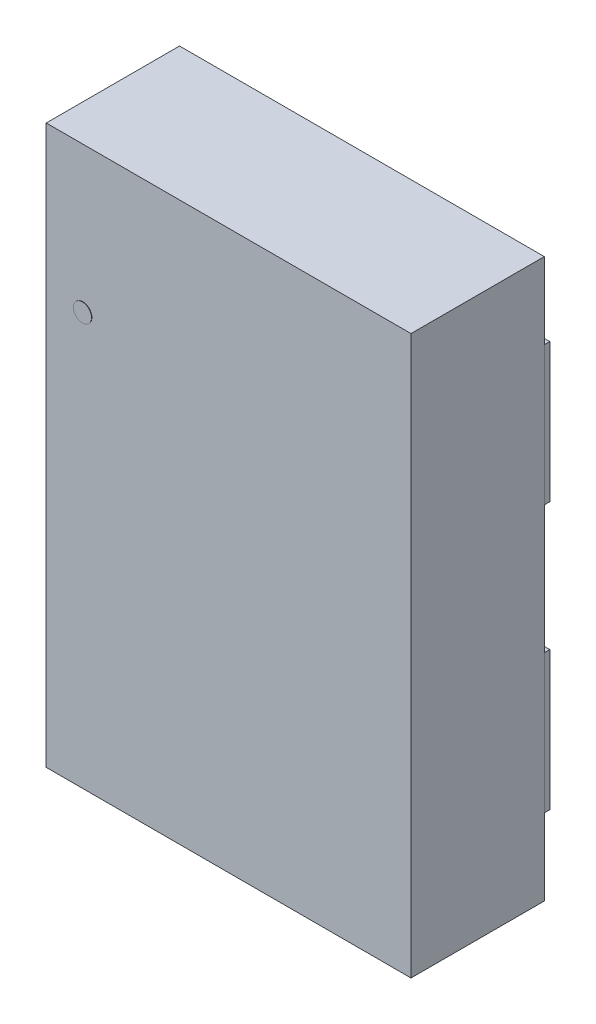
ISO-10303-21;
HEADER;
FILE_DESCRIPTION(('STEP AP214'),'2;1');
FILE_NAME('part.step','',(''),(''),'','','');
FILE_SCHEMA(('AUTOMOTIVE_DESIGN { 1 0 10303 214 1 1 1 1 }'));
ENDSEC;
DATA;
#1=APPLICATION_CONTEXT('core data for automotive mechanical design processes');
#2=APPLICATION_PROTOCOL_DEFINITION('international standard','automotive_design',2000,#1);
#3=PRODUCT_CONTEXT('',#1,'mechanical');
#4=PRODUCT('Part','Part','',(#3));
#5=PRODUCT_RELATED_PRODUCT_CATEGORY('part','',(#4));
#6=PRODUCT_DEFINITION_FORMATION('','',#4);
#7=PRODUCT_DEFINITION_CONTEXT('part definition',#1,'design');
#8=PRODUCT_DEFINITION('design','',#6,#7);
#9=PRODUCT_DEFINITION_SHAPE('','',#8);
#10=(LENGTH_UNIT() NAMED_UNIT(*) SI_UNIT(.MILLI.,.METRE.));
#11=(NAMED_UNIT(*) PLANE_ANGLE_UNIT() SI_UNIT($,.RADIAN.));
#12=(NAMED_UNIT(*) SI_UNIT($,.STERADIAN.) SOLID_ANGLE_UNIT());
#13=UNCERTAINTY_MEASURE_WITH_UNIT(LENGTH_MEASURE(1.E-05),#10,'distance_accuracy_value','');
#14=(GEOMETRIC_REPRESENTATION_CONTEXT(3) GLOBAL_UNCERTAINTY_ASSIGNED_CONTEXT((#13)) GLOBAL_UNIT_ASSIGNED_CONTEXT((#10,
#11,#12)) REPRESENTATION_CONTEXT('',''));
#15=CARTESIAN_POINT('',(0.,0.,0.));
#16=DIRECTION('',(0.,0.,1.));
#17=DIRECTION('',(1.,0.,0.));
#18=AXIS2_PLACEMENT_3D('',#15,#16,#17);
#19=CARTESIAN_POINT('',(1.702,-1.892,0.));
#20=DIRECTION('',(0.,0.,-1.));
#21=DIRECTION('',(-1.,0.,0.));
#22=AXIS2_PLACEMENT_3D('',#19,#20,#21);
#23=PLANE('',#22);
#24=DIRECTION('',(1.,0.,0.));
#25=VECTOR('',#24,1.);
#26=CARTESIAN_POINT('',(1.702,-0.597,0.));
#27=LINE('',#26,#25);
#28=CARTESIAN_POINT('',(1.702,-0.597,0.));
#29=VERTEX_POINT('',#28);
#30=CARTESIAN_POINT('',(0.559,-0.597,0.));
#31=VERTEX_POINT('',#30);
#32=EDGE_CURVE('P0_E62',#29,#31,#27,.F.);
#33=ORIENTED_EDGE('',*,*,#32,.F.);
#34=DIRECTION('',(0.,1.,0.));
#35=VECTOR('',#34,1.);
#36=CARTESIAN_POINT('',(1.702,-1.892,0.));
#37=LINE('',#36,#35);
#38=CARTESIAN_POINT('',(1.702,-1.892,0.));
#39=VERTEX_POINT('',#38);
#40=EDGE_CURVE('P0_E19',#39,#29,#37,.T.);
#41=ORIENTED_EDGE('',*,*,#40,.F.);
#42=DIRECTION('',(1.,0.,0.));
#43=VECTOR('',#42,1.);
#44=CARTESIAN_POINT('',(0.559,-1.892,0.));
#45=LINE('',#44,#43);
#46=CARTESIAN_POINT('',(0.559,-1.892,0.));
#47=VERTEX_POINT('',#46);
#48=EDGE_CURVE('P0_E81',#47,#39,#45,.T.);
#49=ORIENTED_EDGE('',*,*,#48,.F.);
#50=DIRECTION('',(0.,1.,0.));
#51=VECTOR('',#50,1.);
#52=CARTESIAN_POINT('',(0.559,-0.597,0.));
#53=LINE('',#52,#51);
#54=EDGE_CURVE('P0_E60',#31,#47,#53,.F.);
#55=ORIENTED_EDGE('',*,*,#54,.F.);
#56=EDGE_LOOP('',(#33,#41,#49,#55));
#57=FACE_BOUND('',#56,.T.);
#58=ADVANCED_FACE('P0_F16',(#57),#23,.T.);
#59=CARTESIAN_POINT('',(1.702,-1.892,0.));
#60=DIRECTION('',(1.,0.,0.));
#61=DIRECTION('',(0.,0.,-1.));
#62=AXIS2_PLACEMENT_3D('',#59,#60,#61);
#63=PLANE('',#62);
#64=DIRECTION('',(0.,0.,1.));
#65=VECTOR('',#64,1.);
#66=CARTESIAN_POINT('',(1.702,-1.892,0.051));
#67=LINE('',#66,#65);
#68=CARTESIAN_POINT('',(1.702,-1.892,0.051));
#69=VERTEX_POINT('',#68);
#70=CARTESIAN_POINT('',(1.702,-1.892,0.648));
#71=VERTEX_POINT('',#70);
#72=EDGE_CURVE('P0_E34',#69,#71,#67,.T.);
#73=ORIENTED_EDGE('',*,*,#72,.F.);
#74=DIRECTION('',(0.,0.,-1.));
#75=VECTOR('',#74,1.);
#76=CARTESIAN_POINT('',(1.702,-1.892,0.));
#77=LINE('',#76,#75);
#78=EDGE_CURVE('P0_E70',#39,#69,#77,.F.);
#79=ORIENTED_EDGE('',*,*,#78,.F.);
#80=ORIENTED_EDGE('',*,*,#40,.T.);
#81=DIRECTION('',(0.,0.,1.));
#82=VECTOR('',#81,1.);
#83=CARTESIAN_POINT('',(1.702,-0.597,0.));
#84=LINE('',#83,#82);
#85=CARTESIAN_POINT('',(1.702,-0.597,0.051));
#86=VERTEX_POINT('',#85);
#87=EDGE_CURVE('P0_E67',#86,#29,#84,.F.);
#88=ORIENTED_EDGE('',*,*,#87,.F.);
#89=DIRECTION('',(0.,0.,1.));
#90=VECTOR('',#89,1.);
#91=CARTESIAN_POINT('',(1.702,-0.597,0.051));
#92=LINE('',#91,#90);
#93=CARTESIAN_POINT('',(1.702,-0.597,0.648));
#94=VERTEX_POINT('',#93);
#95=EDGE_CURVE('P0_E91',#94,#86,#92,.F.);
#96=ORIENTED_EDGE('',*,*,#95,.F.);
#97=DIRECTION('',(0.,1.,0.));
#98=VECTOR('',#97,1.);
#99=CARTESIAN_POINT('',(1.702,-0.597,0.648));
#100=LINE('',#99,#98);
#101=EDGE_CURVE('P0_E88',#71,#94,#100,.T.);
#102=ORIENTED_EDGE('',*,*,#101,.F.);
#103=EDGE_LOOP('',(#73,#79,#80,#88,#96,#102));
#104=FACE_BOUND('',#103,.T.);
#105=ADVANCED_FACE('P0_F68',(#104),#63,.T.);
#106=CARTESIAN_POINT('',(1.702,-0.597,0.));
#107=DIRECTION('',(0.,1.,0.));
#108=DIRECTION('',(0.,0.,1.));
#109=AXIS2_PLACEMENT_3D('',#106,#107,#108);
#110=PLANE('',#109);
#111=DIRECTION('',(1.,0.,0.));
#112=VECTOR('',#111,1.);
#113=CARTESIAN_POINT('',(1.702,-0.597,0.051));
#114=LINE('',#113,#112);
#115=CARTESIAN_POINT('',(0.559,-0.597,0.051));
#116=VERTEX_POINT('',#115);
#117=EDGE_CURVE('P0_E74',#86,#116,#114,.F.);
#118=ORIENTED_EDGE('',*,*,#117,.F.);
#119=ORIENTED_EDGE('',*,*,#87,.T.);
#120=ORIENTED_EDGE('',*,*,#32,.T.);
#121=DIRECTION('',(0.,0.,1.));
#122=VECTOR('',#121,1.);
#123=CARTESIAN_POINT('',(0.559,-0.597,0.));
#124=LINE('',#123,#122);
#125=EDGE_CURVE('P0_E77',#116,#31,#124,.F.);
#126=ORIENTED_EDGE('',*,*,#125,.F.);
#127=EDGE_LOOP('',(#118,#119,#120,#126));
#128=FACE_BOUND('',#127,.T.);
#129=ADVANCED_FACE('P0_F72',(#128),#110,.T.);
#130=CARTESIAN_POINT('',(0.559,-0.597,0.));
#131=DIRECTION('',(-1.,0.,0.));
#132=DIRECTION('',(0.,0.,1.));
#133=AXIS2_PLACEMENT_3D('',#130,#131,#132);
#134=PLANE('',#133);
#135=DIRECTION('',(0.,1.,0.));
#136=VECTOR('',#135,1.);
#137=CARTESIAN_POINT('',(0.559,-0.597,0.051));
#138=LINE('',#137,#136);
#139=CARTESIAN_POINT('',(0.559,-1.892,0.051));
#140=VERTEX_POINT('',#139);
#141=EDGE_CURVE('P0_E94',#116,#140,#138,.F.);
#142=ORIENTED_EDGE('',*,*,#141,.F.);
#143=ORIENTED_EDGE('',*,*,#125,.T.);
#144=ORIENTED_EDGE('',*,*,#54,.T.);
#145=DIRECTION('',(0.,0.,-1.));
#146=VECTOR('',#145,1.);
#147=CARTESIAN_POINT('',(0.559,-1.892,0.));
#148=LINE('',#147,#146);
#149=EDGE_CURVE('P0_E84',#140,#47,#148,.T.);
#150=ORIENTED_EDGE('',*,*,#149,.F.);
#151=EDGE_LOOP('',(#142,#143,#144,#150));
#152=FACE_BOUND('',#151,.T.);
#153=ADVANCED_FACE('P0_F115',(#152),#134,.T.);
#154=CARTESIAN_POINT('',(0.559,-1.892,0.));
#155=DIRECTION('',(0.,-1.,0.));
#156=DIRECTION('',(0.,0.,-1.));
#157=AXIS2_PLACEMENT_3D('',#154,#155,#156);
#158=PLANE('',#157);
#159=DIRECTION('',(1.,0.,0.));
#160=VECTOR('',#159,1.);
#161=CARTESIAN_POINT('',(1.702,-1.892,0.051));
#162=LINE('',#161,#160);
#163=EDGE_CURVE('P0_E25',#140,#69,#162,.T.);
#164=ORIENTED_EDGE('',*,*,#163,.F.);
#165=ORIENTED_EDGE('',*,*,#149,.T.);
#166=ORIENTED_EDGE('',*,*,#48,.T.);
#167=ORIENTED_EDGE('',*,*,#78,.T.);
#168=EDGE_LOOP('',(#164,#165,#166,#167));
#169=FACE_BOUND('',#168,.T.);
#170=ADVANCED_FACE('P0_F104',(#169),#158,.T.);
#171=CARTESIAN_POINT('',(1.702,-0.597,0.051));
#172=DIRECTION('',(-1.,0.,0.));
#173=DIRECTION('',(0.,0.,1.));
#174=AXIS2_PLACEMENT_3D('',#171,#172,#173);
#175=PLANE('',#174);
#176=ORIENTED_EDGE('',*,*,#101,.T.);
#177=ORIENTED_EDGE('',*,*,#95,.T.);
#178=DIRECTION('',(0.,1.,0.));
#179=VECTOR('',#178,1.);
#180=CARTESIAN_POINT('',(1.702,-0.597,0.051));
#181=LINE('',#180,#179);
#182=EDGE_CURVE('P0_E11',#69,#86,#181,.T.);
#183=ORIENTED_EDGE('',*,*,#182,.F.);
#184=ORIENTED_EDGE('',*,*,#72,.T.);
#185=EDGE_LOOP('',(#176,#177,#183,#184));
#186=FACE_BOUND('',#185,.T.);
#187=ADVANCED_FACE('P0_F106',(#186),#175,.T.);
#188=CARTESIAN_POINT('',(1.702,-0.597,0.051));
#189=DIRECTION('',(0.,0.,1.));
#190=DIRECTION('',(1.,0.,0.));
#191=AXIS2_PLACEMENT_3D('',#188,#189,#190);
#192=PLANE('',#191);
#193=ORIENTED_EDGE('',*,*,#163,.T.);
#194=ORIENTED_EDGE('',*,*,#182,.T.);
#195=ORIENTED_EDGE('',*,*,#117,.T.);
#196=ORIENTED_EDGE('',*,*,#141,.T.);
#197=EDGE_LOOP('',(#193,#194,#195,#196));
#198=FACE_BOUND('',#197,.T.);
#199=ADVANCED_FACE('P0_F100',(#198),#192,.T.);
#200=CLOSED_SHELL('',(#58,#105,#129,#153,#170,#187,#199));
#201=MANIFOLD_SOLID_BREP('P0_B1',#200);
#202=CARTESIAN_POINT('',(1.702,0.597,0.));
#203=DIRECTION('',(0.,0.,-1.));
#204=DIRECTION('',(-1.,0.,0.));
#205=AXIS2_PLACEMENT_3D('',#202,#203,#204);
#206=PLANE('',#205);
#207=DIRECTION('',(1.,0.,0.));
#208=VECTOR('',#207,1.);
#209=CARTESIAN_POINT('',(1.702,1.892,0.));
#210=LINE('',#209,#208);
#211=CARTESIAN_POINT('',(1.702,1.892,0.));
#212=VERTEX_POINT('',#211);
#213=CARTESIAN_POINT('',(0.559,1.892,0.));
#214=VERTEX_POINT('',#213);
#215=EDGE_CURVE('P1_E62',#212,#214,#210,.F.);
#216=ORIENTED_EDGE('',*,*,#215,.F.);
#217=DIRECTION('',(0.,1.,0.));
#218=VECTOR('',#217,1.);
#219=CARTESIAN_POINT('',(1.702,0.597,0.));
#220=LINE('',#219,#218);
#221=CARTESIAN_POINT('',(1.702,0.597,0.));
#222=VERTEX_POINT('',#221);
#223=EDGE_CURVE('P1_E19',#222,#212,#220,.T.);
#224=ORIENTED_EDGE('',*,*,#223,.F.);
#225=DIRECTION('',(1.,0.,0.));
#226=VECTOR('',#225,1.);
#227=CARTESIAN_POINT('',(0.559,0.597,0.));
#228=LINE('',#227,#226);
#229=CARTESIAN_POINT('',(0.559,0.597,0.));
#230=VERTEX_POINT('',#229);
#231=EDGE_CURVE('P1_E81',#230,#222,#228,.T.);
#232=ORIENTED_EDGE('',*,*,#231,.F.);
#233=DIRECTION('',(0.,1.,0.));
#234=VECTOR('',#233,1.);
#235=CARTESIAN_POINT('',(0.559,1.892,0.));
#236=LINE('',#235,#234);
#237=EDGE_CURVE('P1_E60',#214,#230,#236,.F.);
#238=ORIENTED_EDGE('',*,*,#237,.F.);
#239=EDGE_LOOP('',(#216,#224,#232,#238));
#240=FACE_BOUND('',#239,.T.);
#241=ADVANCED_FACE('P1_F16',(#240),#206,.T.);
#242=CARTESIAN_POINT('',(1.702,0.597,0.));
#243=DIRECTION('',(1.,0.,0.));
#244=DIRECTION('',(0.,0.,-1.));
#245=AXIS2_PLACEMENT_3D('',#242,#243,#244);
#246=PLANE('',#245);
#247=DIRECTION('',(0.,0.,1.));
#248=VECTOR('',#247,1.);
#249=CARTESIAN_POINT('',(1.702,0.597,0.051));
#250=LINE('',#249,#248);
#251=CARTESIAN_POINT('',(1.702,0.597,0.051));
#252=VERTEX_POINT('',#251);
#253=CARTESIAN_POINT('',(1.702,0.597,0.648));
#254=VERTEX_POINT('',#253);
#255=EDGE_CURVE('P1_E34',#252,#254,#250,.T.);
#256=ORIENTED_EDGE('',*,*,#255,.F.);
#257=DIRECTION('',(0.,0.,-1.));
#258=VECTOR('',#257,1.);
#259=CARTESIAN_POINT('',(1.702,0.597,0.));
#260=LINE('',#259,#258);
#261=EDGE_CURVE('P1_E70',#222,#252,#260,.F.);
#262=ORIENTED_EDGE('',*,*,#261,.F.);
#263=ORIENTED_EDGE('',*,*,#223,.T.);
#264=DIRECTION('',(0.,0.,1.));
#265=VECTOR('',#264,1.);
#266=CARTESIAN_POINT('',(1.702,1.892,0.));
#267=LINE('',#266,#265);
#268=CARTESIAN_POINT('',(1.702,1.892,0.051));
#269=VERTEX_POINT('',#268);
#270=EDGE_CURVE('P1_E67',#269,#212,#267,.F.);
#271=ORIENTED_EDGE('',*,*,#270,.F.);
#272=DIRECTION('',(0.,0.,1.));
#273=VECTOR('',#272,1.);
#274=CARTESIAN_POINT('',(1.702,1.892,0.051));
#275=LINE('',#274,#273);
#276=CARTESIAN_POINT('',(1.702,1.892,0.648));
#277=VERTEX_POINT('',#276);
#278=EDGE_CURVE('P1_E91',#277,#269,#275,.F.);
#279=ORIENTED_EDGE('',*,*,#278,.F.);
#280=DIRECTION('',(0.,1.,0.));
#281=VECTOR('',#280,1.);
#282=CARTESIAN_POINT('',(1.702,1.892,0.648));
#283=LINE('',#282,#281);
#284=EDGE_CURVE('P1_E88',#254,#277,#283,.T.);
#285=ORIENTED_EDGE('',*,*,#284,.F.);
#286=EDGE_LOOP('',(#256,#262,#263,#271,#279,#285));
#287=FACE_BOUND('',#286,.T.);
#288=ADVANCED_FACE('P1_F68',(#287),#246,.T.);
#289=CARTESIAN_POINT('',(1.702,1.892,0.));
#290=DIRECTION('',(0.,1.,0.));
#291=DIRECTION('',(0.,0.,1.));
#292=AXIS2_PLACEMENT_3D('',#289,#290,#291);
#293=PLANE('',#292);
#294=DIRECTION('',(1.,0.,0.));
#295=VECTOR('',#294,1.);
#296=CARTESIAN_POINT('',(1.702,1.892,0.051));
#297=LINE('',#296,#295);
#298=CARTESIAN_POINT('',(0.559,1.892,0.051));
#299=VERTEX_POINT('',#298);
#300=EDGE_CURVE('P1_E74',#269,#299,#297,.F.);
#301=ORIENTED_EDGE('',*,*,#300,.F.);
#302=ORIENTED_EDGE('',*,*,#270,.T.);
#303=ORIENTED_EDGE('',*,*,#215,.T.);
#304=DIRECTION('',(0.,0.,1.));
#305=VECTOR('',#304,1.);
#306=CARTESIAN_POINT('',(0.559,1.892,0.));
#307=LINE('',#306,#305);
#308=EDGE_CURVE('P1_E77',#299,#214,#307,.F.);
#309=ORIENTED_EDGE('',*,*,#308,.F.);
#310=EDGE_LOOP('',(#301,#302,#303,#309));
#311=FACE_BOUND('',#310,.T.);
#312=ADVANCED_FACE('P1_F72',(#311),#293,.T.);
#313=CARTESIAN_POINT('',(0.559,1.892,0.));
#314=DIRECTION('',(-1.,0.,0.));
#315=DIRECTION('',(0.,0.,1.));
#316=AXIS2_PLACEMENT_3D('',#313,#314,#315);
#317=PLANE('',#316);
#318=DIRECTION('',(0.,1.,0.));
#319=VECTOR('',#318,1.);
#320=CARTESIAN_POINT('',(0.559,1.892,0.051));
#321=LINE('',#320,#319);
#322=CARTESIAN_POINT('',(0.559,0.597,0.051));
#323=VERTEX_POINT('',#322);
#324=EDGE_CURVE('P1_E94',#299,#323,#321,.F.);
#325=ORIENTED_EDGE('',*,*,#324,.F.);
#326=ORIENTED_EDGE('',*,*,#308,.T.);
#327=ORIENTED_EDGE('',*,*,#237,.T.);
#328=DIRECTION('',(0.,0.,-1.));
#329=VECTOR('',#328,1.);
#330=CARTESIAN_POINT('',(0.559,0.597,0.));
#331=LINE('',#330,#329);
#332=EDGE_CURVE('P1_E84',#323,#230,#331,.T.);
#333=ORIENTED_EDGE('',*,*,#332,.F.);
#334=EDGE_LOOP('',(#325,#326,#327,#333));
#335=FACE_BOUND('',#334,.T.);
#336=ADVANCED_FACE('P1_F115',(#335),#317,.T.);
#337=CARTESIAN_POINT('',(0.559,0.597,0.));
#338=DIRECTION('',(0.,-1.,0.));
#339=DIRECTION('',(0.,0.,-1.));
#340=AXIS2_PLACEMENT_3D('',#337,#338,#339);
#341=PLANE('',#340);
#342=DIRECTION('',(1.,0.,0.));
#343=VECTOR('',#342,1.);
#344=CARTESIAN_POINT('',(1.702,0.597,0.051));
#345=LINE('',#344,#343);
#346=EDGE_CURVE('P1_E25',#323,#252,#345,.T.);
#347=ORIENTED_EDGE('',*,*,#346,.F.);
#348=ORIENTED_EDGE('',*,*,#332,.T.);
#349=ORIENTED_EDGE('',*,*,#231,.T.);
#350=ORIENTED_EDGE('',*,*,#261,.T.);
#351=EDGE_LOOP('',(#347,#348,#349,#350));
#352=FACE_BOUND('',#351,.T.);
#353=ADVANCED_FACE('P1_F104',(#352),#341,.T.);
#354=CARTESIAN_POINT('',(1.702,1.892,0.051));
#355=DIRECTION('',(-1.,0.,0.));
#356=DIRECTION('',(0.,0.,1.));
#357=AXIS2_PLACEMENT_3D('',#354,#355,#356);
#358=PLANE('',#357);
#359=ORIENTED_EDGE('',*,*,#284,.T.);
#360=ORIENTED_EDGE('',*,*,#278,.T.);
#361=DIRECTION('',(0.,1.,0.));
#362=VECTOR('',#361,1.);
#363=CARTESIAN_POINT('',(1.702,1.892,0.051));
#364=LINE('',#363,#362);
#365=EDGE_CURVE('P1_E11',#252,#269,#364,.T.);
#366=ORIENTED_EDGE('',*,*,#365,.F.);
#367=ORIENTED_EDGE('',*,*,#255,.T.);
#368=EDGE_LOOP('',(#359,#360,#366,#367));
#369=FACE_BOUND('',#368,.T.);
#370=ADVANCED_FACE('P1_F106',(#369),#358,.T.);
#371=CARTESIAN_POINT('',(1.702,1.892,0.051));
#372=DIRECTION('',(0.,0.,1.));
#373=DIRECTION('',(1.,0.,0.));
#374=AXIS2_PLACEMENT_3D('',#371,#372,#373);
#375=PLANE('',#374);
#376=ORIENTED_EDGE('',*,*,#346,.T.);
#377=ORIENTED_EDGE('',*,*,#365,.T.);
#378=ORIENTED_EDGE('',*,*,#300,.T.);
#379=ORIENTED_EDGE('',*,*,#324,.T.);
#380=EDGE_LOOP('',(#376,#377,#378,#379));
#381=FACE_BOUND('',#380,.T.);
#382=ADVANCED_FACE('P1_F100',(#381),#375,.T.);
#383=CLOSED_SHELL('',(#241,#288,#312,#336,#353,#370,#382));
#384=MANIFOLD_SOLID_BREP('P1_B1',#383);
#385=CARTESIAN_POINT('',(-1.702,-0.597,0.));
#386=DIRECTION('',(0.,0.,-1.));
#387=DIRECTION('',(-1.,0.,0.));
#388=AXIS2_PLACEMENT_3D('',#385,#386,#387);
#389=PLANE('',#388);
#390=DIRECTION('',(1.,0.,0.));
#391=VECTOR('',#390,1.);
#392=CARTESIAN_POINT('',(-1.702,-1.892,0.));
#393=LINE('',#392,#391);
#394=CARTESIAN_POINT('',(-1.702,-1.892,0.));
#395=VERTEX_POINT('',#394);
#396=CARTESIAN_POINT('',(-0.559,-1.892,0.));
#397=VERTEX_POINT('',#396);
#398=EDGE_CURVE('P2_E62',#395,#397,#393,.T.);
#399=ORIENTED_EDGE('',*,*,#398,.F.);
#400=DIRECTION('',(0.,1.,0.));
#401=VECTOR('',#400,1.);
#402=CARTESIAN_POINT('',(-1.702,-0.597,0.));
#403=LINE('',#402,#401);
#404=CARTESIAN_POINT('',(-1.702,-0.597,0.));
#405=VERTEX_POINT('',#404);
#406=EDGE_CURVE('P2_E19',#405,#395,#403,.F.);
#407=ORIENTED_EDGE('',*,*,#406,.F.);
#408=DIRECTION('',(1.,0.,0.));
#409=VECTOR('',#408,1.);
#410=CARTESIAN_POINT('',(-0.559,-0.597,0.));
#411=LINE('',#410,#409);
#412=CARTESIAN_POINT('',(-0.559,-0.597,0.));
#413=VERTEX_POINT('',#412);
#414=EDGE_CURVE('P2_E81',#413,#405,#411,.F.);
#415=ORIENTED_EDGE('',*,*,#414,.F.);
#416=DIRECTION('',(0.,1.,0.));
#417=VECTOR('',#416,1.);
#418=CARTESIAN_POINT('',(-0.559,-1.892,0.));
#419=LINE('',#418,#417);
#420=EDGE_CURVE('P2_E60',#397,#413,#419,.T.);
#421=ORIENTED_EDGE('',*,*,#420,.F.);
#422=EDGE_LOOP('',(#399,#407,#415,#421));
#423=FACE_BOUND('',#422,.T.);
#424=ADVANCED_FACE('P2_F16',(#423),#389,.T.);
#425=CARTESIAN_POINT('',(-1.702,-0.597,0.));
#426=DIRECTION('',(-1.,0.,0.));
#427=DIRECTION('',(0.,0.,1.));
#428=AXIS2_PLACEMENT_3D('',#425,#426,#427);
#429=PLANE('',#428);
#430=DIRECTION('',(0.,0.,-1.));
#431=VECTOR('',#430,1.);
#432=CARTESIAN_POINT('',(-1.702,-0.597,0.051));
#433=LINE('',#432,#431);
#434=CARTESIAN_POINT('',(-1.702,-0.597,0.051));
#435=VERTEX_POINT('',#434);
#436=CARTESIAN_POINT('',(-1.702,-0.597,0.648));
#437=VERTEX_POINT('',#436);
#438=EDGE_CURVE('P2_E34',#435,#437,#433,.F.);
#439=ORIENTED_EDGE('',*,*,#438,.F.);
#440=DIRECTION('',(0.,0.,1.));
#441=VECTOR('',#440,1.);
#442=CARTESIAN_POINT('',(-1.702,-0.597,0.));
#443=LINE('',#442,#441);
#444=EDGE_CURVE('P2_E70',#405,#435,#443,.T.);
#445=ORIENTED_EDGE('',*,*,#444,.F.);
#446=ORIENTED_EDGE('',*,*,#406,.T.);
#447=DIRECTION('',(0.,0.,-1.));
#448=VECTOR('',#447,1.);
#449=CARTESIAN_POINT('',(-1.702,-1.892,0.));
#450=LINE('',#449,#448);
#451=CARTESIAN_POINT('',(-1.702,-1.892,0.051));
#452=VERTEX_POINT('',#451);
#453=EDGE_CURVE('P2_E67',#452,#395,#450,.T.);
#454=ORIENTED_EDGE('',*,*,#453,.F.);
#455=DIRECTION('',(0.,0.,-1.));
#456=VECTOR('',#455,1.);
#457=CARTESIAN_POINT('',(-1.702,-1.892,0.051));
#458=LINE('',#457,#456);
#459=CARTESIAN_POINT('',(-1.702,-1.892,0.648));
#460=VERTEX_POINT('',#459);
#461=EDGE_CURVE('P2_E91',#460,#452,#458,.T.);
#462=ORIENTED_EDGE('',*,*,#461,.F.);
#463=DIRECTION('',(0.,1.,0.));
#464=VECTOR('',#463,1.);
#465=CARTESIAN_POINT('',(-1.702,-1.892,0.648));
#466=LINE('',#465,#464);
#467=EDGE_CURVE('P2_E88',#437,#460,#466,.F.);
#468=ORIENTED_EDGE('',*,*,#467,.F.);
#469=EDGE_LOOP('',(#439,#445,#446,#454,#462,#468));
#470=FACE_BOUND('',#469,.T.);
#471=ADVANCED_FACE('P2_F68',(#470),#429,.T.);
#472=CARTESIAN_POINT('',(-1.702,-1.892,0.));
#473=DIRECTION('',(0.,-1.,0.));
#474=DIRECTION('',(0.,0.,-1.));
#475=AXIS2_PLACEMENT_3D('',#472,#473,#474);
#476=PLANE('',#475);
#477=DIRECTION('',(1.,0.,0.));
#478=VECTOR('',#477,1.);
#479=CARTESIAN_POINT('',(-1.702,-1.892,0.051));
#480=LINE('',#479,#478);
#481=CARTESIAN_POINT('',(-0.559,-1.892,0.051));
#482=VERTEX_POINT('',#481);
#483=EDGE_CURVE('P2_E74',#452,#482,#480,.T.);
#484=ORIENTED_EDGE('',*,*,#483,.F.);
#485=ORIENTED_EDGE('',*,*,#453,.T.);
#486=ORIENTED_EDGE('',*,*,#398,.T.);
#487=DIRECTION('',(0.,0.,-1.));
#488=VECTOR('',#487,1.);
#489=CARTESIAN_POINT('',(-0.559,-1.892,0.));
#490=LINE('',#489,#488);
#491=EDGE_CURVE('P2_E77',#482,#397,#490,.T.);
#492=ORIENTED_EDGE('',*,*,#491,.F.);
#493=EDGE_LOOP('',(#484,#485,#486,#492));
#494=FACE_BOUND('',#493,.T.);
#495=ADVANCED_FACE('P2_F72',(#494),#476,.T.);
#496=CARTESIAN_POINT('',(-0.559,-1.892,0.));
#497=DIRECTION('',(1.,0.,0.));
#498=DIRECTION('',(0.,0.,-1.));
#499=AXIS2_PLACEMENT_3D('',#496,#497,#498);
#500=PLANE('',#499);
#501=DIRECTION('',(0.,1.,0.));
#502=VECTOR('',#501,1.);
#503=CARTESIAN_POINT('',(-0.559,-1.892,0.051));
#504=LINE('',#503,#502);
#505=CARTESIAN_POINT('',(-0.559,-0.597,0.051));
#506=VERTEX_POINT('',#505);
#507=EDGE_CURVE('P2_E94',#482,#506,#504,.T.);
#508=ORIENTED_EDGE('',*,*,#507,.F.);
#509=ORIENTED_EDGE('',*,*,#491,.T.);
#510=ORIENTED_EDGE('',*,*,#420,.T.);
#511=DIRECTION('',(0.,0.,1.));
#512=VECTOR('',#511,1.);
#513=CARTESIAN_POINT('',(-0.559,-0.597,0.));
#514=LINE('',#513,#512);
#515=EDGE_CURVE('P2_E84',#506,#413,#514,.F.);
#516=ORIENTED_EDGE('',*,*,#515,.F.);
#517=EDGE_LOOP('',(#508,#509,#510,#516));
#518=FACE_BOUND('',#517,.T.);
#519=ADVANCED_FACE('P2_F115',(#518),#500,.T.);
#520=CARTESIAN_POINT('',(-0.559,-0.597,0.));
#521=DIRECTION('',(0.,1.,0.));
#522=DIRECTION('',(0.,0.,1.));
#523=AXIS2_PLACEMENT_3D('',#520,#521,#522);
#524=PLANE('',#523);
#525=DIRECTION('',(1.,0.,0.));
#526=VECTOR('',#525,1.);
#527=CARTESIAN_POINT('',(-1.702,-0.597,0.051));
#528=LINE('',#527,#526);
#529=EDGE_CURVE('P2_E25',#506,#435,#528,.F.);
#530=ORIENTED_EDGE('',*,*,#529,.F.);
#531=ORIENTED_EDGE('',*,*,#515,.T.);
#532=ORIENTED_EDGE('',*,*,#414,.T.);
#533=ORIENTED_EDGE('',*,*,#444,.T.);
#534=EDGE_LOOP('',(#530,#531,#532,#533));
#535=FACE_BOUND('',#534,.T.);
#536=ADVANCED_FACE('P2_F104',(#535),#524,.T.);
#537=CARTESIAN_POINT('',(-1.702,-1.892,0.051));
#538=DIRECTION('',(1.,0.,0.));
#539=DIRECTION('',(0.,0.,-1.));
#540=AXIS2_PLACEMENT_3D('',#537,#538,#539);
#541=PLANE('',#540);
#542=ORIENTED_EDGE('',*,*,#467,.T.);
#543=ORIENTED_EDGE('',*,*,#461,.T.);
#544=DIRECTION('',(0.,1.,0.));
#545=VECTOR('',#544,1.);
#546=CARTESIAN_POINT('',(-1.702,-1.892,0.051));
#547=LINE('',#546,#545);
#548=EDGE_CURVE('P2_E11',#435,#452,#547,.F.);
#549=ORIENTED_EDGE('',*,*,#548,.F.);
#550=ORIENTED_EDGE('',*,*,#438,.T.);
#551=EDGE_LOOP('',(#542,#543,#549,#550));
#552=FACE_BOUND('',#551,.T.);
#553=ADVANCED_FACE('P2_F106',(#552),#541,.T.);
#554=CARTESIAN_POINT('',(-1.702,-1.892,0.051));
#555=DIRECTION('',(0.,0.,1.));
#556=DIRECTION('',(1.,0.,0.));
#557=AXIS2_PLACEMENT_3D('',#554,#555,#556);
#558=PLANE('',#557);
#559=ORIENTED_EDGE('',*,*,#529,.T.);
#560=ORIENTED_EDGE('',*,*,#548,.T.);
#561=ORIENTED_EDGE('',*,*,#483,.T.);
#562=ORIENTED_EDGE('',*,*,#507,.T.);
#563=EDGE_LOOP('',(#559,#560,#561,#562));
#564=FACE_BOUND('',#563,.T.);
#565=ADVANCED_FACE('P2_F100',(#564),#558,.T.);
#566=CLOSED_SHELL('',(#424,#471,#495,#519,#536,#553,#565));
#567=MANIFOLD_SOLID_BREP('P2_B1',#566);
#568=CARTESIAN_POINT('',(-1.702,1.892,0.));
#569=DIRECTION('',(0.,0.,-1.));
#570=DIRECTION('',(-1.,0.,0.));
#571=AXIS2_PLACEMENT_3D('',#568,#569,#570);
#572=PLANE('',#571);
#573=DIRECTION('',(1.,0.,0.));
#574=VECTOR('',#573,1.);
#575=CARTESIAN_POINT('',(-1.702,0.597,0.));
#576=LINE('',#575,#574);
#577=CARTESIAN_POINT('',(-1.702,0.597,0.));
#578=VERTEX_POINT('',#577);
#579=CARTESIAN_POINT('',(-0.559,0.597,0.));
#580=VERTEX_POINT('',#579);
#581=EDGE_CURVE('P3_E62',#578,#580,#576,.T.);
#582=ORIENTED_EDGE('',*,*,#581,.F.);
#583=DIRECTION('',(0.,1.,0.));
#584=VECTOR('',#583,1.);
#585=CARTESIAN_POINT('',(-1.702,1.892,0.));
#586=LINE('',#585,#584);
#587=CARTESIAN_POINT('',(-1.702,1.892,0.));
#588=VERTEX_POINT('',#587);
#589=EDGE_CURVE('P3_E19',#588,#578,#586,.F.);
#590=ORIENTED_EDGE('',*,*,#589,.F.);
#591=DIRECTION('',(1.,0.,0.));
#592=VECTOR('',#591,1.);
#593=CARTESIAN_POINT('',(-0.559,1.892,0.));
#594=LINE('',#593,#592);
#595=CARTESIAN_POINT('',(-0.559,1.892,0.));
#596=VERTEX_POINT('',#595);
#597=EDGE_CURVE('P3_E81',#596,#588,#594,.F.);
#598=ORIENTED_EDGE('',*,*,#597,.F.);
#599=DIRECTION('',(0.,1.,0.));
#600=VECTOR('',#599,1.);
#601=CARTESIAN_POINT('',(-0.559,0.597,0.));
#602=LINE('',#601,#600);
#603=EDGE_CURVE('P3_E60',#580,#596,#602,.T.);
#604=ORIENTED_EDGE('',*,*,#603,.F.);
#605=EDGE_LOOP('',(#582,#590,#598,#604));
#606=FACE_BOUND('',#605,.T.);
#607=ADVANCED_FACE('P3_F16',(#606),#572,.T.);
#608=CARTESIAN_POINT('',(-1.702,1.892,0.));
#609=DIRECTION('',(-1.,0.,0.));
#610=DIRECTION('',(0.,0.,1.));
#611=AXIS2_PLACEMENT_3D('',#608,#609,#610);
#612=PLANE('',#611);
#613=DIRECTION('',(0.,0.,-1.));
#614=VECTOR('',#613,1.);
#615=CARTESIAN_POINT('',(-1.702,1.892,0.051));
#616=LINE('',#615,#614);
#617=CARTESIAN_POINT('',(-1.702,1.892,0.051));
#618=VERTEX_POINT('',#617);
#619=CARTESIAN_POINT('',(-1.702,1.892,0.648));
#620=VERTEX_POINT('',#619);
#621=EDGE_CURVE('P3_E34',#618,#620,#616,.F.);
#622=ORIENTED_EDGE('',*,*,#621,.F.);
#623=DIRECTION('',(0.,0.,1.));
#624=VECTOR('',#623,1.);
#625=CARTESIAN_POINT('',(-1.702,1.892,0.));
#626=LINE('',#625,#624);
#627=EDGE_CURVE('P3_E70',#588,#618,#626,.T.);
#628=ORIENTED_EDGE('',*,*,#627,.F.);
#629=ORIENTED_EDGE('',*,*,#589,.T.);
#630=DIRECTION('',(0.,0.,-1.));
#631=VECTOR('',#630,1.);
#632=CARTESIAN_POINT('',(-1.702,0.597,0.));
#633=LINE('',#632,#631);
#634=CARTESIAN_POINT('',(-1.702,0.597,0.051));
#635=VERTEX_POINT('',#634);
#636=EDGE_CURVE('P3_E67',#635,#578,#633,.T.);
#637=ORIENTED_EDGE('',*,*,#636,.F.);
#638=DIRECTION('',(0.,0.,-1.));
#639=VECTOR('',#638,1.);
#640=CARTESIAN_POINT('',(-1.702,0.597,0.051));
#641=LINE('',#640,#639);
#642=CARTESIAN_POINT('',(-1.702,0.597,0.648));
#643=VERTEX_POINT('',#642);
#644=EDGE_CURVE('P3_E91',#643,#635,#641,.T.);
#645=ORIENTED_EDGE('',*,*,#644,.F.);
#646=DIRECTION('',(0.,1.,0.));
#647=VECTOR('',#646,1.);
#648=CARTESIAN_POINT('',(-1.702,0.597,0.648));
#649=LINE('',#648,#647);
#650=EDGE_CURVE('P3_E88',#620,#643,#649,.F.);
#651=ORIENTED_EDGE('',*,*,#650,.F.);
#652=EDGE_LOOP('',(#622,#628,#629,#637,#645,#651));
#653=FACE_BOUND('',#652,.T.);
#654=ADVANCED_FACE('P3_F68',(#653),#612,.T.);
#655=CARTESIAN_POINT('',(-1.702,0.597,0.));
#656=DIRECTION('',(0.,-1.,0.));
#657=DIRECTION('',(0.,0.,-1.));
#658=AXIS2_PLACEMENT_3D('',#655,#656,#657);
#659=PLANE('',#658);
#660=DIRECTION('',(1.,0.,0.));
#661=VECTOR('',#660,1.);
#662=CARTESIAN_POINT('',(-1.702,0.597,0.051));
#663=LINE('',#662,#661);
#664=CARTESIAN_POINT('',(-0.559,0.597,0.051));
#665=VERTEX_POINT('',#664);
#666=EDGE_CURVE('P3_E74',#635,#665,#663,.T.);
#667=ORIENTED_EDGE('',*,*,#666,.F.);
#668=ORIENTED_EDGE('',*,*,#636,.T.);
#669=ORIENTED_EDGE('',*,*,#581,.T.);
#670=DIRECTION('',(0.,0.,-1.));
#671=VECTOR('',#670,1.);
#672=CARTESIAN_POINT('',(-0.559,0.597,0.));
#673=LINE('',#672,#671);
#674=EDGE_CURVE('P3_E77',#665,#580,#673,.T.);
#675=ORIENTED_EDGE('',*,*,#674,.F.);
#676=EDGE_LOOP('',(#667,#668,#669,#675));
#677=FACE_BOUND('',#676,.T.);
#678=ADVANCED_FACE('P3_F72',(#677),#659,.T.);
#679=CARTESIAN_POINT('',(-0.559,0.597,0.));
#680=DIRECTION('',(1.,0.,0.));
#681=DIRECTION('',(0.,0.,-1.));
#682=AXIS2_PLACEMENT_3D('',#679,#680,#681);
#683=PLANE('',#682);
#684=DIRECTION('',(0.,1.,0.));
#685=VECTOR('',#684,1.);
#686=CARTESIAN_POINT('',(-0.559,0.597,0.051));
#687=LINE('',#686,#685);
#688=CARTESIAN_POINT('',(-0.559,1.892,0.051));
#689=VERTEX_POINT('',#688);
#690=EDGE_CURVE('P3_E94',#665,#689,#687,.T.);
#691=ORIENTED_EDGE('',*,*,#690,.F.);
#692=ORIENTED_EDGE('',*,*,#674,.T.);
#693=ORIENTED_EDGE('',*,*,#603,.T.);
#694=DIRECTION('',(0.,0.,1.));
#695=VECTOR('',#694,1.);
#696=CARTESIAN_POINT('',(-0.559,1.892,0.));
#697=LINE('',#696,#695);
#698=EDGE_CURVE('P3_E84',#689,#596,#697,.F.);
#699=ORIENTED_EDGE('',*,*,#698,.F.);
#700=EDGE_LOOP('',(#691,#692,#693,#699));
#701=FACE_BOUND('',#700,.T.);
#702=ADVANCED_FACE('P3_F115',(#701),#683,.T.);
#703=CARTESIAN_POINT('',(-0.559,1.892,0.));
#704=DIRECTION('',(0.,1.,0.));
#705=DIRECTION('',(0.,0.,1.));
#706=AXIS2_PLACEMENT_3D('',#703,#704,#705);
#707=PLANE('',#706);
#708=DIRECTION('',(1.,0.,0.));
#709=VECTOR('',#708,1.);
#710=CARTESIAN_POINT('',(-1.702,1.892,0.051));
#711=LINE('',#710,#709);
#712=EDGE_CURVE('P3_E25',#689,#618,#711,.F.);
#713=ORIENTED_EDGE('',*,*,#712,.F.);
#714=ORIENTED_EDGE('',*,*,#698,.T.);
#715=ORIENTED_EDGE('',*,*,#597,.T.);
#716=ORIENTED_EDGE('',*,*,#627,.T.);
#717=EDGE_LOOP('',(#713,#714,#715,#716));
#718=FACE_BOUND('',#717,.T.);
#719=ADVANCED_FACE('P3_F104',(#718),#707,.T.);
#720=CARTESIAN_POINT('',(-1.702,0.597,0.051));
#721=DIRECTION('',(1.,0.,0.));
#722=DIRECTION('',(0.,0.,-1.));
#723=AXIS2_PLACEMENT_3D('',#720,#721,#722);
#724=PLANE('',#723);
#725=ORIENTED_EDGE('',*,*,#650,.T.);
#726=ORIENTED_EDGE('',*,*,#644,.T.);
#727=DIRECTION('',(0.,1.,0.));
#728=VECTOR('',#727,1.);
#729=CARTESIAN_POINT('',(-1.702,0.597,0.051));
#730=LINE('',#729,#728);
#731=EDGE_CURVE('P3_E11',#618,#635,#730,.F.);
#732=ORIENTED_EDGE('',*,*,#731,.F.);
#733=ORIENTED_EDGE('',*,*,#621,.T.);
#734=EDGE_LOOP('',(#725,#726,#732,#733));
#735=FACE_BOUND('',#734,.T.);
#736=ADVANCED_FACE('P3_F106',(#735),#724,.T.);
#737=CARTESIAN_POINT('',(-1.702,0.597,0.051));
#738=DIRECTION('',(0.,0.,1.));
#739=DIRECTION('',(1.,0.,0.));
#740=AXIS2_PLACEMENT_3D('',#737,#738,#739);
#741=PLANE('',#740);
#742=ORIENTED_EDGE('',*,*,#712,.T.);
#743=ORIENTED_EDGE('',*,*,#731,.T.);
#744=ORIENTED_EDGE('',*,*,#666,.T.);
#745=ORIENTED_EDGE('',*,*,#690,.T.);
#746=EDGE_LOOP('',(#742,#743,#744,#745));
#747=FACE_BOUND('',#746,.T.);
#748=ADVANCED_FACE('P3_F100',(#747),#741,.T.);
#749=CLOSED_SHELL('',(#607,#654,#678,#702,#719,#736,#748));
#750=MANIFOLD_SOLID_BREP('P3_B1',#749);
#751=CARTESIAN_POINT('',(-1.702,-2.604,1.295));
#752=DIRECTION('',(0.,0.,1.));
#753=DIRECTION('',(1.,0.,0.));
#754=AXIS2_PLACEMENT_3D('',#751,#752,#753);
#755=PLANE('',#754);
#756=DIRECTION('',(1.,0.,0.));
#757=VECTOR('',#756,1.);
#758=CARTESIAN_POINT('',(1.702,2.604,1.295));
#759=LINE('',#758,#757);
#760=CARTESIAN_POINT('',(-1.702,2.604,1.295));
#761=VERTEX_POINT('',#760);
#762=CARTESIAN_POINT('',(1.702,2.604,1.295));
#763=VERTEX_POINT('',#762);
#764=EDGE_CURVE('P4_E19',#761,#763,#759,.T.);
#765=ORIENTED_EDGE('',*,*,#764,.F.);
#766=DIRECTION('',(0.,1.,0.));
#767=VECTOR('',#766,1.);
#768=CARTESIAN_POINT('',(-1.702,2.604,1.295));
#769=LINE('',#768,#767);
#770=CARTESIAN_POINT('',(-1.702,-2.604,1.295));
#771=VERTEX_POINT('',#770);
#772=EDGE_CURVE('P4_E79',#771,#761,#769,.T.);
#773=ORIENTED_EDGE('',*,*,#772,.F.);
#774=DIRECTION('',(1.,0.,0.));
#775=VECTOR('',#774,1.);
#776=CARTESIAN_POINT('',(-1.702,-2.604,1.295));
#777=LINE('',#776,#775);
#778=CARTESIAN_POINT('',(1.702,-2.604,1.295));
#779=VERTEX_POINT('',#778);
#780=EDGE_CURVE('P4_E67',#779,#771,#777,.F.);
#781=ORIENTED_EDGE('',*,*,#780,.F.);
#782=DIRECTION('',(0.,1.,0.));
#783=VECTOR('',#782,1.);
#784=CARTESIAN_POINT('',(1.702,-2.604,1.295));
#785=LINE('',#784,#783);
#786=EDGE_CURVE('P4_E54',#763,#779,#785,.F.);
#787=ORIENTED_EDGE('',*,*,#786,.F.);
#788=EDGE_LOOP('',(#765,#773,#781,#787));
#789=FACE_BOUND('',#788,.T.);
#790=ADVANCED_FACE('P4_F16',(#789),#755,.T.);
#791=CARTESIAN_POINT('',(1.702,2.604,0.051));
#792=DIRECTION('',(0.,1.,0.));
#793=DIRECTION('',(0.,0.,1.));
#794=AXIS2_PLACEMENT_3D('',#791,#792,#793);
#795=PLANE('',#794);
#796=ORIENTED_EDGE('',*,*,#764,.T.);
#797=DIRECTION('',(0.,0.,-1.));
#798=VECTOR('',#797,1.);
#799=CARTESIAN_POINT('',(1.702,2.604,0.051));
#800=LINE('',#799,#798);
#801=CARTESIAN_POINT('',(1.702,2.604,0.051));
#802=VERTEX_POINT('',#801);
#803=EDGE_CURVE('P4_E60',#802,#763,#800,.F.);
#804=ORIENTED_EDGE('',*,*,#803,.F.);
#805=DIRECTION('',(-1.,0.,0.));
#806=VECTOR('',#805,1.);
#807=CARTESIAN_POINT('',(-1.702,2.604,0.051));
#808=LINE('',#807,#806);
#809=CARTESIAN_POINT('',(-1.702,2.604,0.051));
#810=VERTEX_POINT('',#809);
#811=EDGE_CURVE('P4_E82',#810,#802,#808,.F.);
#812=ORIENTED_EDGE('',*,*,#811,.F.);
#813=DIRECTION('',(0.,0.,1.));
#814=VECTOR('',#813,1.);
#815=CARTESIAN_POINT('',(-1.702,2.604,0.051));
#816=LINE('',#815,#814);
#817=EDGE_CURVE('P4_E63',#761,#810,#816,.F.);
#818=ORIENTED_EDGE('',*,*,#817,.F.);
#819=EDGE_LOOP('',(#796,#804,#812,#818));
#820=FACE_BOUND('',#819,.T.);
#821=ADVANCED_FACE('P4_F59',(#820),#795,.T.);
#822=CARTESIAN_POINT('',(1.702,-2.604,0.051));
#823=DIRECTION('',(1.,0.,0.));
#824=DIRECTION('',(0.,0.,-1.));
#825=AXIS2_PLACEMENT_3D('',#822,#823,#824);
#826=PLANE('',#825);
#827=ORIENTED_EDGE('',*,*,#786,.T.);
#828=DIRECTION('',(0.,0.,-1.));
#829=VECTOR('',#828,1.);
#830=CARTESIAN_POINT('',(1.702,-2.604,0.051));
#831=LINE('',#830,#829);
#832=CARTESIAN_POINT('',(1.702,-2.604,0.051));
#833=VERTEX_POINT('',#832);
#834=EDGE_CURVE('P4_E69',#833,#779,#831,.F.);
#835=ORIENTED_EDGE('',*,*,#834,.F.);
#836=DIRECTION('',(0.,1.,0.));
#837=VECTOR('',#836,1.);
#838=CARTESIAN_POINT('',(1.702,2.604,0.051));
#839=LINE('',#838,#837);
#840=EDGE_CURVE('P4_E73',#802,#833,#839,.F.);
#841=ORIENTED_EDGE('',*,*,#840,.F.);
#842=ORIENTED_EDGE('',*,*,#803,.T.);
#843=EDGE_LOOP('',(#827,#835,#841,#842));
#844=FACE_BOUND('',#843,.T.);
#845=ADVANCED_FACE('P4_F71',(#844),#826,.T.);
#846=CARTESIAN_POINT('',(-1.702,-2.604,0.051));
#847=DIRECTION('',(0.,-1.,0.));
#848=DIRECTION('',(0.,0.,-1.));
#849=AXIS2_PLACEMENT_3D('',#846,#847,#848);
#850=PLANE('',#849);
#851=ORIENTED_EDGE('',*,*,#780,.T.);
#852=DIRECTION('',(0.,0.,1.));
#853=VECTOR('',#852,1.);
#854=CARTESIAN_POINT('',(-1.702,-2.604,0.051));
#855=LINE('',#854,#853);
#856=CARTESIAN_POINT('',(-1.702,-2.604,0.051));
#857=VERTEX_POINT('',#856);
#858=EDGE_CURVE('P4_E34',#857,#771,#855,.T.);
#859=ORIENTED_EDGE('',*,*,#858,.F.);
#860=DIRECTION('',(-1.,0.,0.));
#861=VECTOR('',#860,1.);
#862=CARTESIAN_POINT('',(-1.702,-2.604,0.051));
#863=LINE('',#862,#861);
#864=EDGE_CURVE('P4_E25',#833,#857,#863,.T.);
#865=ORIENTED_EDGE('',*,*,#864,.F.);
#866=ORIENTED_EDGE('',*,*,#834,.T.);
#867=EDGE_LOOP('',(#851,#859,#865,#866));
#868=FACE_BOUND('',#867,.T.);
#869=ADVANCED_FACE('P4_F88',(#868),#850,.T.);
#870=CARTESIAN_POINT('',(-1.702,2.604,0.051));
#871=DIRECTION('',(-1.,0.,0.));
#872=DIRECTION('',(0.,0.,1.));
#873=AXIS2_PLACEMENT_3D('',#870,#871,#872);
#874=PLANE('',#873);
#875=ORIENTED_EDGE('',*,*,#772,.T.);
#876=ORIENTED_EDGE('',*,*,#817,.T.);
#877=DIRECTION('',(0.,1.,0.));
#878=VECTOR('',#877,1.);
#879=CARTESIAN_POINT('',(-1.702,2.604,0.051));
#880=LINE('',#879,#878);
#881=EDGE_CURVE('P4_E11',#857,#810,#880,.T.);
#882=ORIENTED_EDGE('',*,*,#881,.F.);
#883=ORIENTED_EDGE('',*,*,#858,.T.);
#884=EDGE_LOOP('',(#875,#876,#882,#883));
#885=FACE_BOUND('',#884,.T.);
#886=ADVANCED_FACE('P4_F90',(#885),#874,.T.);
#887=CARTESIAN_POINT('',(-1.702,2.604,0.051));
#888=DIRECTION('',(0.,0.,-1.));
#889=DIRECTION('',(-1.,0.,0.));
#890=AXIS2_PLACEMENT_3D('',#887,#888,#889);
#891=PLANE('',#890);
#892=ORIENTED_EDGE('',*,*,#864,.T.);
#893=ORIENTED_EDGE('',*,*,#881,.T.);
#894=ORIENTED_EDGE('',*,*,#811,.T.);
#895=ORIENTED_EDGE('',*,*,#840,.T.);
#896=EDGE_LOOP('',(#892,#893,#894,#895));
#897=FACE_BOUND('',#896,.T.);
#898=ADVANCED_FACE('P4_F87',(#897),#891,.T.);
#899=CLOSED_SHELL('',(#790,#821,#845,#869,#886,#898));
#900=MANIFOLD_SOLID_BREP('P4_B1',#899);
#901=CARTESIAN_POINT('',(-1.361,1.245,1.295));
#902=DIRECTION('',(0.,0.,1.));
#903=DIRECTION('',(1.,0.,0.));
#904=AXIS2_PLACEMENT_3D('',#901,#902,#903);
#905=PLANE('',#904);
#906=CARTESIAN_POINT('',(-1.361,1.245,1.295));
#907=DIRECTION('',(0.,0.,1.));
#908=DIRECTION('',(1.,0.,0.));
#909=AXIS2_PLACEMENT_3D('',#906,#907,#908);
#910=CIRCLE('',#909,0.08509);
#911=CARTESIAN_POINT('',(-1.27591,1.245,1.295));
#912=VERTEX_POINT('',#911);
#913=EDGE_CURVE('P5_E17',#912,#912,#910,.T.);
#914=ORIENTED_EDGE('',*,*,#913,.F.);
#915=EDGE_LOOP('',(#914));
#916=FACE_BOUND('',#915,.T.);
#917=ADVANCED_FACE('P5_F14',(#916),#905,.F.);
#918=CARTESIAN_POINT('',(-1.361,1.245,1.295));
#919=DIRECTION('',(0.,0.,1.));
#920=DIRECTION('',(1.,0.,0.));
#921=AXIS2_PLACEMENT_3D('',#918,#919,#920);
#922=CYLINDRICAL_SURFACE('',#921,0.08509);
#923=ORIENTED_EDGE('',*,*,#913,.T.);
#924=EDGE_LOOP('',(#923));
#925=FACE_BOUND('',#924,.T.);
#926=CARTESIAN_POINT('',(-1.361,1.245,1.298));
#927=DIRECTION('',(0.,0.,1.));
#928=DIRECTION('',(1.,0.,0.));
#929=AXIS2_PLACEMENT_3D('',#926,#927,#928);
#930=CIRCLE('',#929,0.08509);
#931=CARTESIAN_POINT('',(-1.27591,1.245,1.298));
#932=VERTEX_POINT('',#931);
#933=EDGE_CURVE('P5_E10',#932,#932,#930,.T.);
#934=ORIENTED_EDGE('',*,*,#933,.F.);
#935=EDGE_LOOP('',(#934));
#936=FACE_BOUND('',#935,.T.);
#937=ADVANCED_FACE('P5_F26',(#925,#936),#922,.T.);
#938=CARTESIAN_POINT('',(-1.361,1.245,1.298));
#939=DIRECTION('',(0.,0.,1.));
#940=DIRECTION('',(1.,0.,0.));
#941=AXIS2_PLACEMENT_3D('',#938,#939,#940);
#942=PLANE('',#941);
#943=ORIENTED_EDGE('',*,*,#933,.T.);
#944=EDGE_LOOP('',(#943));
#945=FACE_BOUND('',#944,.T.);
#946=ADVANCED_FACE('P5_F34',(#945),#942,.T.);
#947=CLOSED_SHELL('',(#917,#937,#946));
#948=MANIFOLD_SOLID_BREP('P5_B1',#947);
#949=ADVANCED_BREP_SHAPE_REPRESENTATION('',(#18,#201,#384,#567,#750,#900,#948),#14);
#950=SHAPE_DEFINITION_REPRESENTATION(#9,#949);
ENDSEC;
END-ISO-10303-21;
